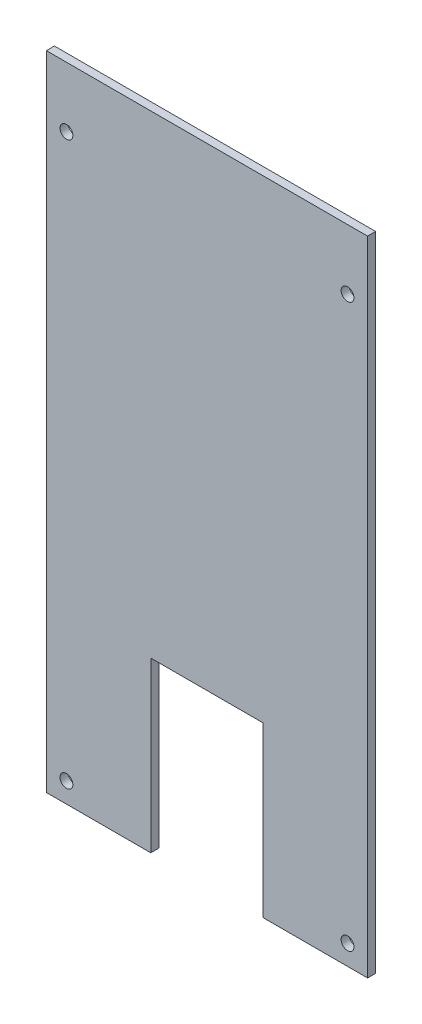
ISO-10303-21;
HEADER;
FILE_DESCRIPTION(('STEP AP214'),'2;1');
FILE_NAME('part.step','',(''),(''),'','','');
FILE_SCHEMA(('AUTOMOTIVE_DESIGN { 1 0 10303 214 1 1 1 1 }'));
ENDSEC;
DATA;
#1=APPLICATION_CONTEXT('core data for automotive mechanical design processes');
#2=APPLICATION_PROTOCOL_DEFINITION('international standard','automotive_design',2000,#1);
#3=PRODUCT_CONTEXT('',#1,'mechanical');
#4=PRODUCT('Part','Part','',(#3));
#5=PRODUCT_RELATED_PRODUCT_CATEGORY('part','',(#4));
#6=PRODUCT_DEFINITION_FORMATION('','',#4);
#7=PRODUCT_DEFINITION_CONTEXT('part definition',#1,'design');
#8=PRODUCT_DEFINITION('design','',#6,#7);
#9=PRODUCT_DEFINITION_SHAPE('','',#8);
#10=(LENGTH_UNIT() NAMED_UNIT(*) SI_UNIT(.MILLI.,.METRE.));
#11=(NAMED_UNIT(*) PLANE_ANGLE_UNIT() SI_UNIT($,.RADIAN.));
#12=(NAMED_UNIT(*) SI_UNIT($,.STERADIAN.) SOLID_ANGLE_UNIT());
#13=UNCERTAINTY_MEASURE_WITH_UNIT(LENGTH_MEASURE(1.E-05),#10,'distance_accuracy_value','');
#14=(GEOMETRIC_REPRESENTATION_CONTEXT(3) GLOBAL_UNCERTAINTY_ASSIGNED_CONTEXT((#13)) GLOBAL_UNIT_ASSIGNED_CONTEXT((#10,
#11,#12)) REPRESENTATION_CONTEXT('',''));
#15=CARTESIAN_POINT('',(0.,0.,0.));
#16=DIRECTION('',(0.,0.,1.));
#17=DIRECTION('',(1.,0.,0.));
#18=AXIS2_PLACEMENT_3D('',#15,#16,#17);
#19=CARTESIAN_POINT('',(0.,160.,2.));
#20=DIRECTION('',(0.,1.,0.));
#21=DIRECTION('',(0.,0.,1.));
#22=AXIS2_PLACEMENT_3D('',#19,#20,#21);
#23=PLANE('',#22);
#24=DIRECTION('',(1.,0.,0.));
#25=VECTOR('',#24,1.);
#26=CARTESIAN_POINT('',(0.,160.,0.));
#27=LINE('',#26,#25);
#28=CARTESIAN_POINT('',(0.,160.,0.));
#29=VERTEX_POINT('',#28);
#30=CARTESIAN_POINT('',(80.,160.,0.));
#31=VERTEX_POINT('',#30);
#32=EDGE_CURVE('E128',#29,#31,#27,.T.);
#33=ORIENTED_EDGE('',*,*,#32,.F.);
#34=DIRECTION('',(0.,0.,-1.));
#35=VECTOR('',#34,1.);
#36=CARTESIAN_POINT('',(0.,160.,2.));
#37=LINE('',#36,#35);
#38=CARTESIAN_POINT('',(0.,160.,2.));
#39=VERTEX_POINT('',#38);
#40=EDGE_CURVE('E11',#39,#29,#37,.T.);
#41=ORIENTED_EDGE('',*,*,#40,.F.);
#42=DIRECTION('',(1.,0.,0.));
#43=VECTOR('',#42,1.);
#44=CARTESIAN_POINT('',(0.,160.,2.));
#45=LINE('',#44,#43);
#46=CARTESIAN_POINT('',(80.,160.,2.));
#47=VERTEX_POINT('',#46);
#48=EDGE_CURVE('E147',#39,#47,#45,.T.);
#49=ORIENTED_EDGE('',*,*,#48,.T.);
#50=DIRECTION('',(0.,0.,-1.));
#51=VECTOR('',#50,1.);
#52=CARTESIAN_POINT('',(80.,160.,2.));
#53=LINE('',#52,#51);
#54=EDGE_CURVE('E86',#47,#31,#53,.T.);
#55=ORIENTED_EDGE('',*,*,#54,.T.);
#56=EDGE_LOOP('',(#33,#41,#49,#55));
#57=FACE_BOUND('',#56,.T.);
#58=ADVANCED_FACE('F35',(#57),#23,.T.);
#59=CARTESIAN_POINT('',(0.,0.,2.));
#60=DIRECTION('',(-1.,0.,0.));
#61=DIRECTION('',(0.,-1.,0.));
#62=AXIS2_PLACEMENT_3D('',#59,#60,#61);
#63=PLANE('',#62);
#64=DIRECTION('',(0.,1.,0.));
#65=VECTOR('',#64,1.);
#66=CARTESIAN_POINT('',(0.,0.,0.));
#67=LINE('',#66,#65);
#68=CARTESIAN_POINT('',(0.,0.,0.));
#69=VERTEX_POINT('',#68);
#70=EDGE_CURVE('E131',#69,#29,#67,.T.);
#71=ORIENTED_EDGE('',*,*,#70,.F.);
#72=DIRECTION('',(0.,0.,-1.));
#73=VECTOR('',#72,1.);
#74=CARTESIAN_POINT('',(0.,0.,2.));
#75=LINE('',#74,#73);
#76=CARTESIAN_POINT('',(0.,0.,2.));
#77=VERTEX_POINT('',#76);
#78=EDGE_CURVE('E43',#77,#69,#75,.T.);
#79=ORIENTED_EDGE('',*,*,#78,.F.);
#80=DIRECTION('',(0.,1.,0.));
#81=VECTOR('',#80,1.);
#82=CARTESIAN_POINT('',(0.,0.,2.));
#83=LINE('',#82,#81);
#84=EDGE_CURVE('E169',#77,#39,#83,.T.);
#85=ORIENTED_EDGE('',*,*,#84,.T.);
#86=ORIENTED_EDGE('',*,*,#40,.T.);
#87=EDGE_LOOP('',(#71,#79,#85,#86));
#88=FACE_BOUND('',#87,.T.);
#89=ADVANCED_FACE('F168',(#88),#63,.T.);
#90=CARTESIAN_POINT('',(0.,0.,2.));
#91=DIRECTION('',(0.,1.,0.));
#92=DIRECTION('',(0.,0.,1.));
#93=AXIS2_PLACEMENT_3D('',#90,#91,#92);
#94=PLANE('',#93);
#95=DIRECTION('',(1.,0.,0.));
#96=VECTOR('',#95,1.);
#97=CARTESIAN_POINT('',(0.,0.,0.));
#98=LINE('',#97,#96);
#99=CARTESIAN_POINT('',(26.,0.,0.));
#100=VERTEX_POINT('',#99);
#101=EDGE_CURVE('E135',#69,#100,#98,.T.);
#102=ORIENTED_EDGE('',*,*,#101,.T.);
#103=DIRECTION('',(0.,0.,-1.));
#104=VECTOR('',#103,1.);
#105=CARTESIAN_POINT('',(26.,0.,2.));
#106=LINE('',#105,#104);
#107=CARTESIAN_POINT('',(26.,0.,2.));
#108=VERTEX_POINT('',#107);
#109=EDGE_CURVE('E153',#108,#100,#106,.T.);
#110=ORIENTED_EDGE('',*,*,#109,.F.);
#111=DIRECTION('',(1.,0.,0.));
#112=VECTOR('',#111,1.);
#113=CARTESIAN_POINT('',(0.,0.,2.));
#114=LINE('',#113,#112);
#115=EDGE_CURVE('E159',#77,#108,#114,.T.);
#116=ORIENTED_EDGE('',*,*,#115,.F.);
#117=ORIENTED_EDGE('',*,*,#78,.T.);
#118=EDGE_LOOP('',(#102,#110,#116,#117));
#119=FACE_BOUND('',#118,.T.);
#120=ADVANCED_FACE('F157',(#119),#94,.F.);
#121=CARTESIAN_POINT('',(26.,0.,2.));
#122=DIRECTION('',(1.,0.,0.));
#123=DIRECTION('',(0.,1.,0.));
#124=AXIS2_PLACEMENT_3D('',#121,#122,#123);
#125=PLANE('',#124);
#126=DIRECTION('',(0.,-1.,0.));
#127=VECTOR('',#126,1.);
#128=CARTESIAN_POINT('',(26.,0.,0.));
#129=LINE('',#128,#127);
#130=CARTESIAN_POINT('',(26.,42.,0.));
#131=VERTEX_POINT('',#130);
#132=EDGE_CURVE('E138',#131,#100,#129,.T.);
#133=ORIENTED_EDGE('',*,*,#132,.F.);
#134=DIRECTION('',(0.,0.,-1.));
#135=VECTOR('',#134,1.);
#136=CARTESIAN_POINT('',(26.,42.,2.));
#137=LINE('',#136,#135);
#138=CARTESIAN_POINT('',(26.,42.,2.));
#139=VERTEX_POINT('',#138);
#140=EDGE_CURVE('E151',#139,#131,#137,.T.);
#141=ORIENTED_EDGE('',*,*,#140,.F.);
#142=DIRECTION('',(0.,-1.,0.));
#143=VECTOR('',#142,1.);
#144=CARTESIAN_POINT('',(26.,0.,2.));
#145=LINE('',#144,#143);
#146=EDGE_CURVE('E179',#139,#108,#145,.T.);
#147=ORIENTED_EDGE('',*,*,#146,.T.);
#148=ORIENTED_EDGE('',*,*,#109,.T.);
#149=EDGE_LOOP('',(#133,#141,#147,#148));
#150=FACE_BOUND('',#149,.T.);
#151=ADVANCED_FACE('F182',(#150),#125,.T.);
#152=CARTESIAN_POINT('',(0.,42.,2.));
#153=DIRECTION('',(0.,1.,0.));
#154=DIRECTION('',(0.,0.,1.));
#155=AXIS2_PLACEMENT_3D('',#152,#153,#154);
#156=PLANE('',#155);
#157=DIRECTION('',(1.,0.,0.));
#158=VECTOR('',#157,1.);
#159=CARTESIAN_POINT('',(0.,42.,0.));
#160=LINE('',#159,#158);
#161=CARTESIAN_POINT('',(54.,42.,0.));
#162=VERTEX_POINT('',#161);
#163=EDGE_CURVE('E141',#131,#162,#160,.T.);
#164=ORIENTED_EDGE('',*,*,#163,.T.);
#165=DIRECTION('',(0.,0.,-1.));
#166=VECTOR('',#165,1.);
#167=CARTESIAN_POINT('',(54.,42.,2.));
#168=LINE('',#167,#166);
#169=CARTESIAN_POINT('',(54.,42.,2.));
#170=VERTEX_POINT('',#169);
#171=EDGE_CURVE('E120',#170,#162,#168,.T.);
#172=ORIENTED_EDGE('',*,*,#171,.F.);
#173=DIRECTION('',(1.,0.,0.));
#174=VECTOR('',#173,1.);
#175=CARTESIAN_POINT('',(0.,42.,2.));
#176=LINE('',#175,#174);
#177=EDGE_CURVE('E111',#139,#170,#176,.T.);
#178=ORIENTED_EDGE('',*,*,#177,.F.);
#179=ORIENTED_EDGE('',*,*,#140,.T.);
#180=EDGE_LOOP('',(#164,#172,#178,#179));
#181=FACE_BOUND('',#180,.T.);
#182=ADVANCED_FACE('F184',(#181),#156,.F.);
#183=CARTESIAN_POINT('',(54.,0.,2.));
#184=DIRECTION('',(1.,0.,0.));
#185=DIRECTION('',(0.,1.,0.));
#186=AXIS2_PLACEMENT_3D('',#183,#184,#185);
#187=PLANE('',#186);
#188=DIRECTION('',(0.,-1.,0.));
#189=VECTOR('',#188,1.);
#190=CARTESIAN_POINT('',(54.,0.,0.));
#191=LINE('',#190,#189);
#192=CARTESIAN_POINT('',(54.,0.,0.));
#193=VERTEX_POINT('',#192);
#194=EDGE_CURVE('E119',#162,#193,#191,.T.);
#195=ORIENTED_EDGE('',*,*,#194,.T.);
#196=DIRECTION('',(0.,0.,-1.));
#197=VECTOR('',#196,1.);
#198=CARTESIAN_POINT('',(54.,0.,2.));
#199=LINE('',#198,#197);
#200=CARTESIAN_POINT('',(54.,0.,2.));
#201=VERTEX_POINT('',#200);
#202=EDGE_CURVE('E116',#201,#193,#199,.T.);
#203=ORIENTED_EDGE('',*,*,#202,.F.);
#204=DIRECTION('',(0.,-1.,0.));
#205=VECTOR('',#204,1.);
#206=CARTESIAN_POINT('',(54.,0.,2.));
#207=LINE('',#206,#205);
#208=EDGE_CURVE('E104',#170,#201,#207,.T.);
#209=ORIENTED_EDGE('',*,*,#208,.F.);
#210=ORIENTED_EDGE('',*,*,#171,.T.);
#211=EDGE_LOOP('',(#195,#203,#209,#210));
#212=FACE_BOUND('',#211,.T.);
#213=ADVANCED_FACE('F117',(#212),#187,.F.);
#214=CARTESIAN_POINT('',(0.,0.,2.));
#215=DIRECTION('',(0.,1.,0.));
#216=DIRECTION('',(0.,0.,1.));
#217=AXIS2_PLACEMENT_3D('',#214,#215,#216);
#218=PLANE('',#217);
#219=DIRECTION('',(1.,0.,0.));
#220=VECTOR('',#219,1.);
#221=CARTESIAN_POINT('',(0.,0.,0.));
#222=LINE('',#221,#220);
#223=CARTESIAN_POINT('',(80.,0.,0.));
#224=VERTEX_POINT('',#223);
#225=EDGE_CURVE('E79',#193,#224,#222,.T.);
#226=ORIENTED_EDGE('',*,*,#225,.T.);
#227=DIRECTION('',(0.,0.,-1.));
#228=VECTOR('',#227,1.);
#229=CARTESIAN_POINT('',(80.,0.,2.));
#230=LINE('',#229,#228);
#231=CARTESIAN_POINT('',(80.,0.,2.));
#232=VERTEX_POINT('',#231);
#233=EDGE_CURVE('E121',#232,#224,#230,.T.);
#234=ORIENTED_EDGE('',*,*,#233,.F.);
#235=DIRECTION('',(1.,0.,0.));
#236=VECTOR('',#235,1.);
#237=CARTESIAN_POINT('',(0.,0.,2.));
#238=LINE('',#237,#236);
#239=EDGE_CURVE('E108',#201,#232,#238,.T.);
#240=ORIENTED_EDGE('',*,*,#239,.F.);
#241=ORIENTED_EDGE('',*,*,#202,.T.);
#242=EDGE_LOOP('',(#226,#234,#240,#241));
#243=FACE_BOUND('',#242,.T.);
#244=ADVANCED_FACE('F123',(#243),#218,.F.);
#245=CARTESIAN_POINT('',(80.,0.,2.));
#246=DIRECTION('',(-1.,0.,0.));
#247=DIRECTION('',(0.,-1.,0.));
#248=AXIS2_PLACEMENT_3D('',#245,#246,#247);
#249=PLANE('',#248);
#250=DIRECTION('',(0.,1.,0.));
#251=VECTOR('',#250,1.);
#252=CARTESIAN_POINT('',(80.,0.,0.));
#253=LINE('',#252,#251);
#254=EDGE_CURVE('E145',#224,#31,#253,.T.);
#255=ORIENTED_EDGE('',*,*,#254,.T.);
#256=ORIENTED_EDGE('',*,*,#54,.F.);
#257=DIRECTION('',(0.,1.,0.));
#258=VECTOR('',#257,1.);
#259=CARTESIAN_POINT('',(80.,0.,2.));
#260=LINE('',#259,#258);
#261=EDGE_CURVE('E51',#232,#47,#260,.T.);
#262=ORIENTED_EDGE('',*,*,#261,.F.);
#263=ORIENTED_EDGE('',*,*,#233,.T.);
#264=EDGE_LOOP('',(#255,#256,#262,#263));
#265=FACE_BOUND('',#264,.T.);
#266=ADVANCED_FACE('F172',(#265),#249,.F.);
#267=CARTESIAN_POINT('',(0.,0.,2.));
#268=DIRECTION('',(0.,0.,1.));
#269=DIRECTION('',(1.,0.,0.));
#270=AXIS2_PLACEMENT_3D('',#267,#268,#269);
#271=PLANE('',#270);
#272=CARTESIAN_POINT('',(75.,145.,2.));
#273=DIRECTION('',(0.,0.,1.));
#274=DIRECTION('',(1.,0.,0.));
#275=AXIS2_PLACEMENT_3D('',#272,#273,#274);
#276=CIRCLE('',#275,1.60000000000002);
#277=CARTESIAN_POINT('',(76.6,145.,2.));
#278=VERTEX_POINT('',#277);
#279=EDGE_CURVE('E132',#278,#278,#276,.F.);
#280=ORIENTED_EDGE('',*,*,#279,.T.);
#281=EDGE_LOOP('',(#280));
#282=FACE_BOUND('',#281,.T.);
#283=CARTESIAN_POINT('',(75.,5.00000000000001,2.));
#284=DIRECTION('',(0.,0.,1.));
#285=DIRECTION('',(1.,0.,0.));
#286=AXIS2_PLACEMENT_3D('',#283,#284,#285);
#287=CIRCLE('',#286,1.59999999999999);
#288=CARTESIAN_POINT('',(76.6,5.00000000000001,2.));
#289=VERTEX_POINT('',#288);
#290=EDGE_CURVE('E318',#289,#289,#287,.F.);
#291=ORIENTED_EDGE('',*,*,#290,.T.);
#292=EDGE_LOOP('',(#291));
#293=FACE_BOUND('',#292,.T.);
#294=CARTESIAN_POINT('',(5.00000000000002,5.,2.));
#295=DIRECTION('',(0.,0.,1.));
#296=DIRECTION('',(1.,0.,0.));
#297=AXIS2_PLACEMENT_3D('',#294,#295,#296);
#298=CIRCLE('',#297,1.6);
#299=CARTESIAN_POINT('',(6.60000000000002,5.,2.));
#300=VERTEX_POINT('',#299);
#301=EDGE_CURVE('E316',#300,#300,#298,.F.);
#302=ORIENTED_EDGE('',*,*,#301,.T.);
#303=EDGE_LOOP('',(#302));
#304=FACE_BOUND('',#303,.T.);
#305=CARTESIAN_POINT('',(5.,145.,2.));
#306=DIRECTION('',(0.,0.,1.));
#307=DIRECTION('',(1.,0.,0.));
#308=AXIS2_PLACEMENT_3D('',#305,#306,#307);
#309=CIRCLE('',#308,1.59999999999999);
#310=CARTESIAN_POINT('',(6.59999999999999,145.,2.));
#311=VERTEX_POINT('',#310);
#312=EDGE_CURVE('E313',#311,#311,#309,.F.);
#313=ORIENTED_EDGE('',*,*,#312,.T.);
#314=EDGE_LOOP('',(#313));
#315=FACE_BOUND('',#314,.T.);
#316=ORIENTED_EDGE('',*,*,#48,.F.);
#317=ORIENTED_EDGE('',*,*,#84,.F.);
#318=ORIENTED_EDGE('',*,*,#115,.T.);
#319=ORIENTED_EDGE('',*,*,#146,.F.);
#320=ORIENTED_EDGE('',*,*,#177,.T.);
#321=ORIENTED_EDGE('',*,*,#208,.T.);
#322=ORIENTED_EDGE('',*,*,#239,.T.);
#323=ORIENTED_EDGE('',*,*,#261,.T.);
#324=EDGE_LOOP('',(#316,#317,#318,#319,#320,#321,#322,#323));
#325=FACE_BOUND('',#324,.T.);
#326=ADVANCED_FACE('F106',(#282,#293,#304,#315,#325),#271,.T.);
#327=CARTESIAN_POINT('',(0.,0.,0.));
#328=DIRECTION('',(0.,0.,1.));
#329=DIRECTION('',(1.,0.,0.));
#330=AXIS2_PLACEMENT_3D('',#327,#328,#329);
#331=PLANE('',#330);
#332=CARTESIAN_POINT('',(75.,145.,0.));
#333=DIRECTION('',(0.,0.,1.));
#334=DIRECTION('',(-1.,0.,0.));
#335=AXIS2_PLACEMENT_3D('',#332,#333,#334);
#336=CIRCLE('',#335,1.60000000000002);
#337=CARTESIAN_POINT('',(73.4,145.,0.));
#338=VERTEX_POINT('',#337);
#339=EDGE_CURVE('E302',#338,#338,#336,.T.);
#340=ORIENTED_EDGE('',*,*,#339,.T.);
#341=EDGE_LOOP('',(#340));
#342=FACE_BOUND('',#341,.T.);
#343=CARTESIAN_POINT('',(75.,5.00000000000001,0.));
#344=DIRECTION('',(0.,0.,1.));
#345=DIRECTION('',(-1.,0.,0.));
#346=AXIS2_PLACEMENT_3D('',#343,#344,#345);
#347=CIRCLE('',#346,1.59999999999999);
#348=CARTESIAN_POINT('',(73.4,5.00000000000001,0.));
#349=VERTEX_POINT('',#348);
#350=EDGE_CURVE('E303',#349,#349,#347,.T.);
#351=ORIENTED_EDGE('',*,*,#350,.T.);
#352=EDGE_LOOP('',(#351));
#353=FACE_BOUND('',#352,.T.);
#354=CARTESIAN_POINT('',(5.00000000000002,5.,0.));
#355=DIRECTION('',(0.,0.,1.));
#356=DIRECTION('',(1.,0.,0.));
#357=AXIS2_PLACEMENT_3D('',#354,#355,#356);
#358=CIRCLE('',#357,1.6);
#359=CARTESIAN_POINT('',(6.60000000000002,5.,0.));
#360=VERTEX_POINT('',#359);
#361=EDGE_CURVE('E306',#360,#360,#358,.T.);
#362=ORIENTED_EDGE('',*,*,#361,.T.);
#363=EDGE_LOOP('',(#362));
#364=FACE_BOUND('',#363,.T.);
#365=CARTESIAN_POINT('',(5.,145.,0.));
#366=DIRECTION('',(0.,0.,1.));
#367=DIRECTION('',(1.,0.,0.));
#368=AXIS2_PLACEMENT_3D('',#365,#366,#367);
#369=CIRCLE('',#368,1.59999999999999);
#370=CARTESIAN_POINT('',(6.59999999999999,145.,0.));
#371=VERTEX_POINT('',#370);
#372=EDGE_CURVE('E310',#371,#371,#369,.T.);
#373=ORIENTED_EDGE('',*,*,#372,.T.);
#374=EDGE_LOOP('',(#373));
#375=FACE_BOUND('',#374,.T.);
#376=ORIENTED_EDGE('',*,*,#32,.T.);
#377=ORIENTED_EDGE('',*,*,#254,.F.);
#378=ORIENTED_EDGE('',*,*,#225,.F.);
#379=ORIENTED_EDGE('',*,*,#194,.F.);
#380=ORIENTED_EDGE('',*,*,#163,.F.);
#381=ORIENTED_EDGE('',*,*,#132,.T.);
#382=ORIENTED_EDGE('',*,*,#101,.F.);
#383=ORIENTED_EDGE('',*,*,#70,.T.);
#384=EDGE_LOOP('',(#376,#377,#378,#379,#380,#381,#382,#383));
#385=FACE_BOUND('',#384,.T.);
#386=ADVANCED_FACE('F165',(#342,#353,#364,#375,#385),#331,.F.);
#387=CARTESIAN_POINT('',(5.,145.,10.));
#388=DIRECTION('',(0.,0.,-1.));
#389=DIRECTION('',(-1.,0.,0.));
#390=AXIS2_PLACEMENT_3D('',#387,#388,#389);
#391=CYLINDRICAL_SURFACE('',#390,1.59999999999999);
#392=ORIENTED_EDGE('',*,*,#312,.F.);
#393=EDGE_LOOP('',(#392));
#394=FACE_BOUND('',#393,.T.);
#395=ORIENTED_EDGE('',*,*,#372,.F.);
#396=EDGE_LOOP('',(#395));
#397=FACE_BOUND('',#396,.T.);
#398=ADVANCED_FACE('F253',(#394,#397),#391,.F.);
#399=CARTESIAN_POINT('',(5.00000000000002,5.,10.));
#400=DIRECTION('',(0.,0.,-1.));
#401=DIRECTION('',(-1.,0.,0.));
#402=AXIS2_PLACEMENT_3D('',#399,#400,#401);
#403=CYLINDRICAL_SURFACE('',#402,1.6);
#404=ORIENTED_EDGE('',*,*,#301,.F.);
#405=EDGE_LOOP('',(#404));
#406=FACE_BOUND('',#405,.T.);
#407=ORIENTED_EDGE('',*,*,#361,.F.);
#408=EDGE_LOOP('',(#407));
#409=FACE_BOUND('',#408,.T.);
#410=ADVANCED_FACE('F263',(#406,#409),#403,.F.);
#411=CARTESIAN_POINT('',(75.,5.00000000000001,10.));
#412=DIRECTION('',(0.,0.,-1.));
#413=DIRECTION('',(-1.,0.,0.));
#414=AXIS2_PLACEMENT_3D('',#411,#412,#413);
#415=CYLINDRICAL_SURFACE('',#414,1.59999999999999);
#416=ORIENTED_EDGE('',*,*,#290,.F.);
#417=EDGE_LOOP('',(#416));
#418=FACE_BOUND('',#417,.T.);
#419=ORIENTED_EDGE('',*,*,#350,.F.);
#420=EDGE_LOOP('',(#419));
#421=FACE_BOUND('',#420,.T.);
#422=ADVANCED_FACE('F273',(#418,#421),#415,.F.);
#423=CARTESIAN_POINT('',(75.,145.,10.));
#424=DIRECTION('',(0.,0.,-1.));
#425=DIRECTION('',(-1.,0.,0.));
#426=AXIS2_PLACEMENT_3D('',#423,#424,#425);
#427=CYLINDRICAL_SURFACE('',#426,1.60000000000002);
#428=ORIENTED_EDGE('',*,*,#279,.F.);
#429=EDGE_LOOP('',(#428));
#430=FACE_BOUND('',#429,.T.);
#431=ORIENTED_EDGE('',*,*,#339,.F.);
#432=EDGE_LOOP('',(#431));
#433=FACE_BOUND('',#432,.T.);
#434=ADVANCED_FACE('F283',(#430,#433),#427,.F.);
#435=CLOSED_SHELL('',(#58,#89,#120,#151,#182,#213,#244,#266,#326,#386,#398,#410,#422,#434));
#436=MANIFOLD_SOLID_BREP('B2',#435);
#437=ADVANCED_BREP_SHAPE_REPRESENTATION('',(#18,#436),#14);
#438=SHAPE_DEFINITION_REPRESENTATION(#9,#437);
ENDSEC;
END-ISO-10303-21;
